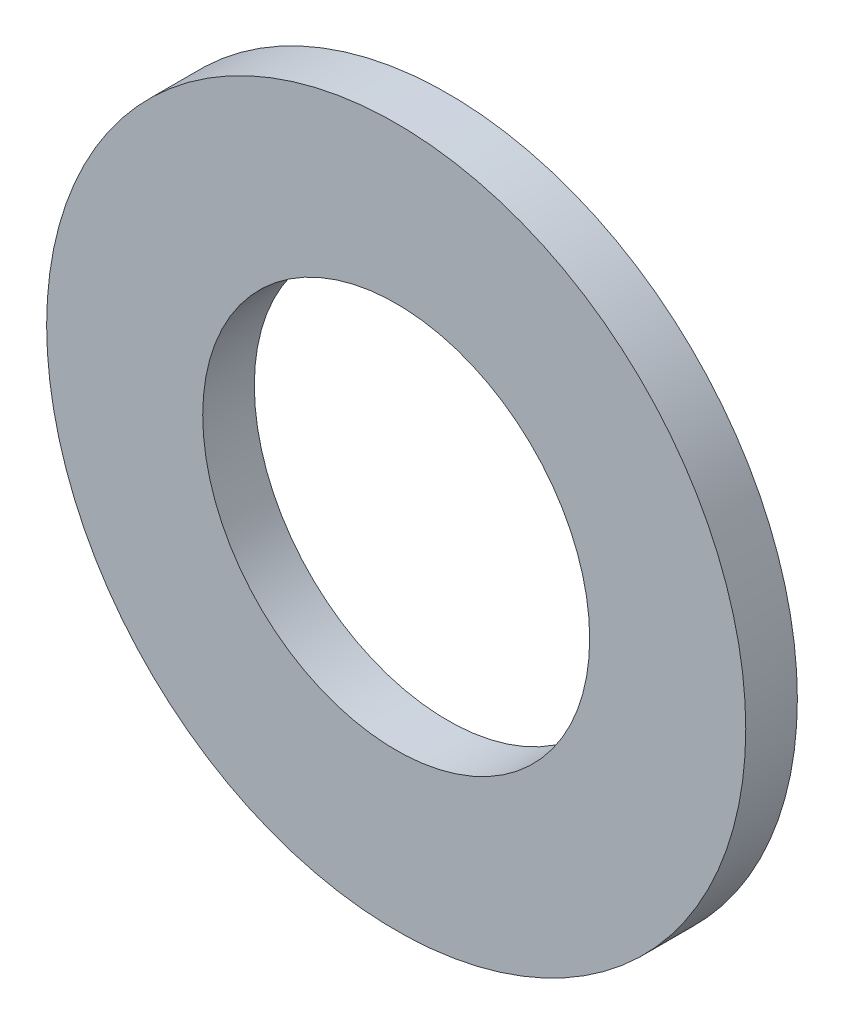
ISO-10303-21;
HEADER;
FILE_DESCRIPTION(('STEP AP214'),'2;1');
FILE_NAME('part.step','',(''),(''),'','','');
FILE_SCHEMA(('AUTOMOTIVE_DESIGN { 1 0 10303 214 1 1 1 1 }'));
ENDSEC;
DATA;
#1=APPLICATION_CONTEXT('core data for automotive mechanical design processes');
#2=APPLICATION_PROTOCOL_DEFINITION('international standard','automotive_design',2000,#1);
#3=PRODUCT_CONTEXT('',#1,'mechanical');
#4=PRODUCT('Part','Part','',(#3));
#5=PRODUCT_RELATED_PRODUCT_CATEGORY('part','',(#4));
#6=PRODUCT_DEFINITION_FORMATION('','',#4);
#7=PRODUCT_DEFINITION_CONTEXT('part definition',#1,'design');
#8=PRODUCT_DEFINITION('design','',#6,#7);
#9=PRODUCT_DEFINITION_SHAPE('','',#8);
#10=(LENGTH_UNIT() NAMED_UNIT(*) SI_UNIT(.MILLI.,.METRE.));
#11=(NAMED_UNIT(*) PLANE_ANGLE_UNIT() SI_UNIT($,.RADIAN.));
#12=(NAMED_UNIT(*) SI_UNIT($,.STERADIAN.) SOLID_ANGLE_UNIT());
#13=UNCERTAINTY_MEASURE_WITH_UNIT(LENGTH_MEASURE(1.E-05),#10,'distance_accuracy_value','');
#14=(GEOMETRIC_REPRESENTATION_CONTEXT(3) GLOBAL_UNCERTAINTY_ASSIGNED_CONTEXT((#13)) GLOBAL_UNIT_ASSIGNED_CONTEXT((#10,
#11,#12)) REPRESENTATION_CONTEXT('',''));
#15=CARTESIAN_POINT('',(0.,0.,0.));
#16=DIRECTION('',(0.,0.,1.));
#17=DIRECTION('',(1.,0.,0.));
#18=AXIS2_PLACEMENT_3D('',#15,#16,#17);
#19=CARTESIAN_POINT('',(0.,0.,0.508));
#20=DIRECTION('',(0.,0.,1.));
#21=DIRECTION('',(1.,0.,0.));
#22=AXIS2_PLACEMENT_3D('',#19,#20,#21);
#23=PLANE('',#22);
#24=CARTESIAN_POINT('',(0.,0.,0.508));
#25=DIRECTION('',(0.,0.,-1.));
#26=DIRECTION('',(-1.,0.,0.));
#27=AXIS2_PLACEMENT_3D('',#24,#25,#26);
#28=CIRCLE('',#27,1.905);
#29=CARTESIAN_POINT('',(-1.905,0.,0.508));
#30=VERTEX_POINT('',#29);
#31=EDGE_CURVE('E31',#30,#30,#28,.T.);
#32=ORIENTED_EDGE('',*,*,#31,.T.);
#33=EDGE_LOOP('',(#32));
#34=FACE_BOUND('',#33,.T.);
#35=CARTESIAN_POINT('',(0.,0.,0.508));
#36=DIRECTION('',(0.,0.,-1.));
#37=DIRECTION('',(-1.,0.,0.));
#38=AXIS2_PLACEMENT_3D('',#35,#36,#37);
#39=CIRCLE('',#38,3.4417);
#40=CARTESIAN_POINT('',(-3.4417,0.,0.508));
#41=VERTEX_POINT('',#40);
#42=EDGE_CURVE('E18',#41,#41,#39,.T.);
#43=ORIENTED_EDGE('',*,*,#42,.F.);
#44=EDGE_LOOP('',(#43));
#45=FACE_BOUND('',#44,.T.);
#46=ADVANCED_FACE('F15',(#34,#45),#23,.T.);
#47=CARTESIAN_POINT('',(0.,0.,0.508));
#48=DIRECTION('',(0.,0.,-1.));
#49=DIRECTION('',(-1.,0.,0.));
#50=AXIS2_PLACEMENT_3D('',#47,#48,#49);
#51=CYLINDRICAL_SURFACE('',#50,3.4417);
#52=ORIENTED_EDGE('',*,*,#42,.T.);
#53=EDGE_LOOP('',(#52));
#54=FACE_BOUND('',#53,.T.);
#55=CARTESIAN_POINT('',(0.,0.,0.));
#56=DIRECTION('',(0.,0.,-1.));
#57=DIRECTION('',(-1.,0.,0.));
#58=AXIS2_PLACEMENT_3D('',#55,#56,#57);
#59=CIRCLE('',#58,3.4417);
#60=CARTESIAN_POINT('',(-3.4417,0.,0.));
#61=VERTEX_POINT('',#60);
#62=EDGE_CURVE('E23',#61,#61,#59,.F.);
#63=ORIENTED_EDGE('',*,*,#62,.T.);
#64=EDGE_LOOP('',(#63));
#65=FACE_BOUND('',#64,.T.);
#66=ADVANCED_FACE('F40',(#54,#65),#51,.T.);
#67=CARTESIAN_POINT('',(0.,0.,0.508));
#68=DIRECTION('',(0.,0.,-1.));
#69=DIRECTION('',(-1.,0.,0.));
#70=AXIS2_PLACEMENT_3D('',#67,#68,#69);
#71=CYLINDRICAL_SURFACE('',#70,1.905);
#72=ORIENTED_EDGE('',*,*,#31,.F.);
#73=EDGE_LOOP('',(#72));
#74=FACE_BOUND('',#73,.T.);
#75=CARTESIAN_POINT('',(0.,0.,0.));
#76=DIRECTION('',(0.,0.,-1.));
#77=DIRECTION('',(-1.,0.,0.));
#78=AXIS2_PLACEMENT_3D('',#75,#76,#77);
#79=CIRCLE('',#78,1.905);
#80=CARTESIAN_POINT('',(-1.905,0.,0.));
#81=VERTEX_POINT('',#80);
#82=EDGE_CURVE('E10',#81,#81,#79,.T.);
#83=ORIENTED_EDGE('',*,*,#82,.T.);
#84=EDGE_LOOP('',(#83));
#85=FACE_BOUND('',#84,.T.);
#86=ADVANCED_FACE('F48',(#74,#85),#71,.F.);
#87=CARTESIAN_POINT('',(0.,0.,0.));
#88=DIRECTION('',(0.,0.,1.));
#89=DIRECTION('',(1.,0.,0.));
#90=AXIS2_PLACEMENT_3D('',#87,#88,#89);
#91=PLANE('',#90);
#92=ORIENTED_EDGE('',*,*,#82,.F.);
#93=EDGE_LOOP('',(#92));
#94=FACE_BOUND('',#93,.T.);
#95=ORIENTED_EDGE('',*,*,#62,.F.);
#96=EDGE_LOOP('',(#95));
#97=FACE_BOUND('',#96,.T.);
#98=ADVANCED_FACE('F49',(#94,#97),#91,.F.);
#99=CLOSED_SHELL('',(#46,#66,#86,#98));
#100=MANIFOLD_SOLID_BREP('B1',#99);
#101=ADVANCED_BREP_SHAPE_REPRESENTATION('',(#18,#100),#14);
#102=SHAPE_DEFINITION_REPRESENTATION(#9,#101);
ENDSEC;
END-ISO-10303-21;
